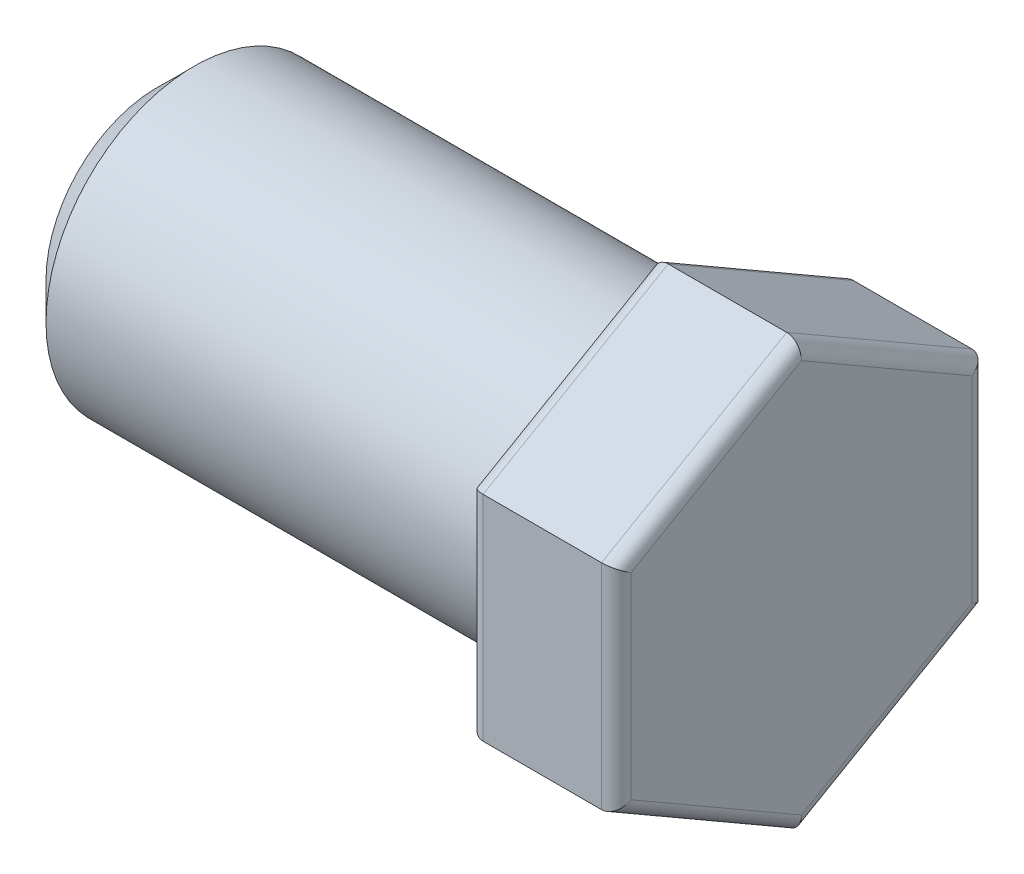
ISO-10303-21;
HEADER;
FILE_DESCRIPTION(('STEP AP214'),'2;1');
FILE_NAME('part.step','',(''),(''),'','','');
FILE_SCHEMA(('AUTOMOTIVE_DESIGN { 1 0 10303 214 1 1 1 1 }'));
ENDSEC;
DATA;
#1=APPLICATION_CONTEXT('core data for automotive mechanical design processes');
#2=APPLICATION_PROTOCOL_DEFINITION('international standard','automotive_design',2000,#1);
#3=PRODUCT_CONTEXT('',#1,'mechanical');
#4=PRODUCT('Part','Part','',(#3));
#5=PRODUCT_RELATED_PRODUCT_CATEGORY('part','',(#4));
#6=PRODUCT_DEFINITION_FORMATION('','',#4);
#7=PRODUCT_DEFINITION_CONTEXT('part definition',#1,'design');
#8=PRODUCT_DEFINITION('design','',#6,#7);
#9=PRODUCT_DEFINITION_SHAPE('','',#8);
#10=(LENGTH_UNIT() NAMED_UNIT(*) SI_UNIT(.MILLI.,.METRE.));
#11=(NAMED_UNIT(*) PLANE_ANGLE_UNIT() SI_UNIT($,.RADIAN.));
#12=(NAMED_UNIT(*) SI_UNIT($,.STERADIAN.) SOLID_ANGLE_UNIT());
#13=UNCERTAINTY_MEASURE_WITH_UNIT(LENGTH_MEASURE(1.E-05),#10,'distance_accuracy_value','');
#14=(GEOMETRIC_REPRESENTATION_CONTEXT(3) GLOBAL_UNCERTAINTY_ASSIGNED_CONTEXT((#13)) GLOBAL_UNIT_ASSIGNED_CONTEXT((#10,
#11,#12)) REPRESENTATION_CONTEXT('',''));
#15=CARTESIAN_POINT('',(0.,0.,0.));
#16=DIRECTION('',(0.,0.,1.));
#17=DIRECTION('',(1.,0.,0.));
#18=AXIS2_PLACEMENT_3D('',#15,#16,#17);
#19=CARTESIAN_POINT('',(1.,-1.44337567297404,-2.50000000000001));
#20=DIRECTION('',(0.,0.,1.));
#21=DIRECTION('',(0.,-1.,0.));
#22=AXIS2_PLACEMENT_3D('',#19,#20,#21);
#23=PLANE('',#22);
#24=DIRECTION('',(-1.,0.,0.));
#25=VECTOR('',#24,1.);
#26=CARTESIAN_POINT('',(1.,1.44337567297409,-2.49999999999999));
#27=LINE('',#26,#25);
#28=CARTESIAN_POINT('',(0.8,1.44337567297409,-2.49999999999999));
#29=VERTEX_POINT('',#28);
#30=CARTESIAN_POINT('',(-0.8,1.44337567297409,-2.49999999999999));
#31=VERTEX_POINT('',#30);
#32=EDGE_CURVE('E157',#29,#31,#27,.T.);
#33=ORIENTED_EDGE('',*,*,#32,.F.);
#34=DIRECTION('',(0.,1.,0.));
#35=VECTOR('',#34,1.);
#36=CARTESIAN_POINT('',(0.8,-1.44337567297404,-2.50000000000001));
#37=LINE('',#36,#35);
#38=CARTESIAN_POINT('',(0.8,-1.44337567297404,-2.50000000000001));
#39=VERTEX_POINT('',#38);
#40=EDGE_CURVE('E203',#29,#39,#37,.F.);
#41=ORIENTED_EDGE('',*,*,#40,.T.);
#42=DIRECTION('',(-1.,0.,0.));
#43=VECTOR('',#42,1.);
#44=CARTESIAN_POINT('',(1.,-1.44337567297404,-2.50000000000001));
#45=LINE('',#44,#43);
#46=CARTESIAN_POINT('',(-0.8,-1.44337567297404,-2.50000000000001));
#47=VERTEX_POINT('',#46);
#48=EDGE_CURVE('E239',#39,#47,#45,.T.);
#49=ORIENTED_EDGE('',*,*,#48,.T.);
#50=DIRECTION('',(0.,1.,0.));
#51=VECTOR('',#50,1.);
#52=CARTESIAN_POINT('',(-0.8,-1.44337567297404,-2.50000000000001));
#53=LINE('',#52,#51);
#54=EDGE_CURVE('E200',#47,#31,#53,.T.);
#55=ORIENTED_EDGE('',*,*,#54,.T.);
#56=EDGE_LOOP('',(#33,#41,#49,#55));
#57=FACE_BOUND('',#56,.T.);
#58=ADVANCED_FACE('F44',(#57),#23,.F.);
#59=CARTESIAN_POINT('',(1.,1.44337567297409,-2.49999999999999));
#60=DIRECTION('',(0.,-0.866025403784443,0.499999999999993));
#61=DIRECTION('',(0.,-0.499999999999993,-0.866025403784443));
#62=AXIS2_PLACEMENT_3D('',#59,#60,#61);
#63=PLANE('',#62);
#64=DIRECTION('',(-1.,0.,0.));
#65=VECTOR('',#64,1.);
#66=CARTESIAN_POINT('',(1.,2.88675134594813,0.));
#67=LINE('',#66,#65);
#68=CARTESIAN_POINT('',(0.8,2.88675134594813,0.));
#69=VERTEX_POINT('',#68);
#70=CARTESIAN_POINT('',(-0.8,2.88675134594813,0.));
#71=VERTEX_POINT('',#70);
#72=EDGE_CURVE('E366',#69,#71,#67,.T.);
#73=ORIENTED_EDGE('',*,*,#72,.F.);
#74=DIRECTION('',(0.,0.499999999999993,0.866025403784443));
#75=VECTOR('',#74,1.);
#76=CARTESIAN_POINT('',(0.8,1.44337567297409,-2.49999999999999));
#77=LINE('',#76,#75);
#78=EDGE_CURVE('E197',#69,#29,#77,.F.);
#79=ORIENTED_EDGE('',*,*,#78,.T.);
#80=ORIENTED_EDGE('',*,*,#32,.T.);
#81=DIRECTION('',(0.,0.499999999999993,0.866025403784443));
#82=VECTOR('',#81,1.);
#83=CARTESIAN_POINT('',(-0.8,1.44337567297409,-2.49999999999999));
#84=LINE('',#83,#82);
#85=EDGE_CURVE('E193',#31,#71,#84,.T.);
#86=ORIENTED_EDGE('',*,*,#85,.T.);
#87=EDGE_LOOP('',(#73,#79,#80,#86));
#88=FACE_BOUND('',#87,.T.);
#89=ADVANCED_FACE('F284',(#88),#63,.F.);
#90=CARTESIAN_POINT('',(1.,2.88675134594813,0.));
#91=DIRECTION('',(0.,-0.866025403784434,-0.500000000000007));
#92=DIRECTION('',(0.,0.500000000000007,-0.866025403784434));
#93=AXIS2_PLACEMENT_3D('',#90,#91,#92);
#94=PLANE('',#93);
#95=DIRECTION('',(-1.,0.,0.));
#96=VECTOR('',#95,1.);
#97=CARTESIAN_POINT('',(1.,1.44337567297404,2.50000000000001));
#98=LINE('',#97,#96);
#99=CARTESIAN_POINT('',(0.8,1.44337567297404,2.50000000000001));
#100=VERTEX_POINT('',#99);
#101=CARTESIAN_POINT('',(-0.8,1.44337567297404,2.50000000000001));
#102=VERTEX_POINT('',#101);
#103=EDGE_CURVE('E369',#100,#102,#98,.T.);
#104=ORIENTED_EDGE('',*,*,#103,.F.);
#105=DIRECTION('',(0.,-0.500000000000007,0.866025403784434));
#106=VECTOR('',#105,1.);
#107=CARTESIAN_POINT('',(0.8,2.88675134594813,0.));
#108=LINE('',#107,#106);
#109=EDGE_CURVE('E190',#100,#69,#108,.F.);
#110=ORIENTED_EDGE('',*,*,#109,.T.);
#111=ORIENTED_EDGE('',*,*,#72,.T.);
#112=DIRECTION('',(0.,-0.500000000000007,0.866025403784434));
#113=VECTOR('',#112,1.);
#114=CARTESIAN_POINT('',(-0.8,2.88675134594813,0.));
#115=LINE('',#114,#113);
#116=EDGE_CURVE('E187',#71,#102,#115,.T.);
#117=ORIENTED_EDGE('',*,*,#116,.T.);
#118=EDGE_LOOP('',(#104,#110,#111,#117));
#119=FACE_BOUND('',#118,.T.);
#120=ADVANCED_FACE('F290',(#119),#94,.F.);
#121=CARTESIAN_POINT('',(1.,1.44337567297404,2.50000000000001));
#122=DIRECTION('',(0.,0.,-1.));
#123=DIRECTION('',(0.,1.,0.));
#124=AXIS2_PLACEMENT_3D('',#121,#122,#123);
#125=PLANE('',#124);
#126=DIRECTION('',(-1.,0.,0.));
#127=VECTOR('',#126,1.);
#128=CARTESIAN_POINT('',(1.,-1.44337567297409,2.49999999999999));
#129=LINE('',#128,#127);
#130=CARTESIAN_POINT('',(0.8,-1.44337567297409,2.49999999999999));
#131=VERTEX_POINT('',#130);
#132=CARTESIAN_POINT('',(-0.8,-1.44337567297409,2.49999999999999));
#133=VERTEX_POINT('',#132);
#134=EDGE_CURVE('E394',#131,#133,#129,.T.);
#135=ORIENTED_EDGE('',*,*,#134,.F.);
#136=DIRECTION('',(0.,-1.,0.));
#137=VECTOR('',#136,1.);
#138=CARTESIAN_POINT('',(0.8,1.44337567297404,2.50000000000001));
#139=LINE('',#138,#137);
#140=EDGE_CURVE('E184',#131,#100,#139,.F.);
#141=ORIENTED_EDGE('',*,*,#140,.T.);
#142=ORIENTED_EDGE('',*,*,#103,.T.);
#143=DIRECTION('',(0.,-1.,0.));
#144=VECTOR('',#143,1.);
#145=CARTESIAN_POINT('',(-0.8,1.44337567297404,2.50000000000001));
#146=LINE('',#145,#144);
#147=EDGE_CURVE('E181',#102,#133,#146,.T.);
#148=ORIENTED_EDGE('',*,*,#147,.T.);
#149=EDGE_LOOP('',(#135,#141,#142,#148));
#150=FACE_BOUND('',#149,.T.);
#151=ADVANCED_FACE('F404',(#150),#125,.F.);
#152=CARTESIAN_POINT('',(1.,-1.44337567297409,2.49999999999999));
#153=DIRECTION('',(0.,0.866025403784443,-0.499999999999993));
#154=DIRECTION('',(0.,0.499999999999993,0.866025403784443));
#155=AXIS2_PLACEMENT_3D('',#152,#153,#154);
#156=PLANE('',#155);
#157=DIRECTION('',(-1.,0.,0.));
#158=VECTOR('',#157,1.);
#159=CARTESIAN_POINT('',(1.,-2.88675134594813,0.));
#160=LINE('',#159,#158);
#161=CARTESIAN_POINT('',(0.8,-2.88675134594813,0.));
#162=VERTEX_POINT('',#161);
#163=CARTESIAN_POINT('',(-0.8,-2.88675134594813,0.));
#164=VERTEX_POINT('',#163);
#165=EDGE_CURVE('E391',#162,#164,#160,.T.);
#166=ORIENTED_EDGE('',*,*,#165,.F.);
#167=DIRECTION('',(0.,-0.499999999999993,-0.866025403784443));
#168=VECTOR('',#167,1.);
#169=CARTESIAN_POINT('',(0.8,-1.44337567297409,2.49999999999999));
#170=LINE('',#169,#168);
#171=EDGE_CURVE('E178',#162,#131,#170,.F.);
#172=ORIENTED_EDGE('',*,*,#171,.T.);
#173=ORIENTED_EDGE('',*,*,#134,.T.);
#174=DIRECTION('',(0.,-0.499999999999993,-0.866025403784443));
#175=VECTOR('',#174,1.);
#176=CARTESIAN_POINT('',(-0.8,-1.44337567297409,2.49999999999999));
#177=LINE('',#176,#175);
#178=EDGE_CURVE('E175',#133,#164,#177,.T.);
#179=ORIENTED_EDGE('',*,*,#178,.T.);
#180=EDGE_LOOP('',(#166,#172,#173,#179));
#181=FACE_BOUND('',#180,.T.);
#182=ADVANCED_FACE('F392',(#181),#156,.F.);
#183=CARTESIAN_POINT('',(1.,-2.88675134594813,0.));
#184=DIRECTION('',(0.,0.866025403784434,0.500000000000008));
#185=DIRECTION('',(0.,-0.500000000000008,0.866025403784434));
#186=AXIS2_PLACEMENT_3D('',#183,#184,#185);
#187=PLANE('',#186);
#188=ORIENTED_EDGE('',*,*,#48,.F.);
#189=DIRECTION('',(0.,0.500000000000008,-0.866025403784434));
#190=VECTOR('',#189,1.);
#191=CARTESIAN_POINT('',(0.8,-2.88675134594813,0.));
#192=LINE('',#191,#190);
#193=EDGE_CURVE('E141',#39,#162,#192,.F.);
#194=ORIENTED_EDGE('',*,*,#193,.T.);
#195=ORIENTED_EDGE('',*,*,#165,.T.);
#196=DIRECTION('',(0.,0.500000000000008,-0.866025403784434));
#197=VECTOR('',#196,1.);
#198=CARTESIAN_POINT('',(-0.8,-2.88675134594813,0.));
#199=LINE('',#198,#197);
#200=EDGE_CURVE('E164',#164,#47,#199,.T.);
#201=ORIENTED_EDGE('',*,*,#200,.T.);
#202=EDGE_LOOP('',(#188,#194,#195,#201));
#203=FACE_BOUND('',#202,.T.);
#204=ADVANCED_FACE('F390',(#203),#187,.F.);
#205=CARTESIAN_POINT('',(1.,0.,0.));
#206=DIRECTION('',(1.,0.,0.));
#207=DIRECTION('',(0.,0.,-1.));
#208=AXIS2_PLACEMENT_3D('',#205,#206,#207);
#209=PLANE('',#208);
#210=DIRECTION('',(0.,-0.499999999999993,-0.866025403784443));
#211=VECTOR('',#210,1.);
#212=CARTESIAN_POINT('',(1.,-2.71354626519124,-0.100000000000023));
#213=LINE('',#212,#211);
#214=CARTESIAN_POINT('',(1.,-1.32790561913616,2.29999999999999));
#215=VERTEX_POINT('',#214);
#216=CARTESIAN_POINT('',(1.,-2.65581123827228,0.));
#217=VERTEX_POINT('',#216);
#218=EDGE_CURVE('E161',#215,#217,#213,.T.);
#219=ORIENTED_EDGE('',*,*,#218,.T.);
#220=DIRECTION('',(0.,0.500000000000008,-0.866025403784434));
#221=VECTOR('',#220,1.);
#222=CARTESIAN_POINT('',(1.,-1.27017059221715,-2.40000000000001));
#223=LINE('',#222,#221);
#224=CARTESIAN_POINT('',(1.,-1.32790561913612,-2.30000000000001));
#225=VERTEX_POINT('',#224);
#226=EDGE_CURVE('E139',#217,#225,#223,.T.);
#227=ORIENTED_EDGE('',*,*,#226,.T.);
#228=DIRECTION('',(0.,1.,0.));
#229=VECTOR('',#228,1.);
#230=CARTESIAN_POINT('',(1.,1.44337567297409,-2.29999999999999));
#231=LINE('',#230,#229);
#232=CARTESIAN_POINT('',(1.,1.32790561913616,-2.29999999999999));
#233=VERTEX_POINT('',#232);
#234=EDGE_CURVE('E149',#225,#233,#231,.T.);
#235=ORIENTED_EDGE('',*,*,#234,.T.);
#236=DIRECTION('',(0.,0.499999999999993,0.866025403784443));
#237=VECTOR('',#236,1.);
#238=CARTESIAN_POINT('',(1.,2.71354626519124,0.100000000000023));
#239=LINE('',#238,#237);
#240=CARTESIAN_POINT('',(1.,2.65581123827228,0.));
#241=VERTEX_POINT('',#240);
#242=EDGE_CURVE('E156',#233,#241,#239,.T.);
#243=ORIENTED_EDGE('',*,*,#242,.T.);
#244=DIRECTION('',(0.,-0.500000000000007,0.866025403784434));
#245=VECTOR('',#244,1.);
#246=CARTESIAN_POINT('',(1.,1.27017059221716,2.40000000000001));
#247=LINE('',#246,#245);
#248=CARTESIAN_POINT('',(1.,1.32790561913612,2.30000000000001));
#249=VERTEX_POINT('',#248);
#250=EDGE_CURVE('E375',#241,#249,#247,.T.);
#251=ORIENTED_EDGE('',*,*,#250,.T.);
#252=DIRECTION('',(0.,-1.,0.));
#253=VECTOR('',#252,1.);
#254=CARTESIAN_POINT('',(1.,-1.44337567297408,2.29999999999999));
#255=LINE('',#254,#253);
#256=EDGE_CURVE('E169',#249,#215,#255,.T.);
#257=ORIENTED_EDGE('',*,*,#256,.T.);
#258=EDGE_LOOP('',(#219,#227,#235,#243,#251,#257));
#259=FACE_BOUND('',#258,.T.);
#260=ADVANCED_FACE('F159',(#259),#209,.T.);
#261=CARTESIAN_POINT('',(-1.,0.,0.));
#262=DIRECTION('',(1.,0.,0.));
#263=DIRECTION('',(0.,0.,-1.));
#264=AXIS2_PLACEMENT_3D('',#261,#262,#263);
#265=PLANE('',#264);
#266=CARTESIAN_POINT('',(-1.,0.,0.));
#267=DIRECTION('',(1.,0.,0.));
#268=DIRECTION('',(0.,0.,-1.));
#269=AXIS2_PLACEMENT_3D('',#266,#267,#268);
#270=CIRCLE('',#269,2.2);
#271=CARTESIAN_POINT('',(-1.,0.,-2.2));
#272=VERTEX_POINT('',#271);
#273=EDGE_CURVE('E11',#272,#272,#270,.T.);
#274=ORIENTED_EDGE('',*,*,#273,.T.);
#275=EDGE_LOOP('',(#274));
#276=FACE_BOUND('',#275,.T.);
#277=DIRECTION('',(0.,-0.500000000000007,0.866025403784434));
#278=VECTOR('',#277,1.);
#279=CARTESIAN_POINT('',(-1.,1.9918584287042,1.15000000000002));
#280=LINE('',#279,#278);
#281=CARTESIAN_POINT('',(-1.,1.32790561913612,2.30000000000001));
#282=VERTEX_POINT('',#281);
#283=CARTESIAN_POINT('',(-1.,2.65581123827228,0.));
#284=VERTEX_POINT('',#283);
#285=EDGE_CURVE('E60',#282,#284,#280,.F.);
#286=ORIENTED_EDGE('',*,*,#285,.T.);
#287=DIRECTION('',(0.,0.499999999999993,0.866025403784443));
#288=VECTOR('',#287,1.);
#289=CARTESIAN_POINT('',(-1.,1.99185842870422,-1.14999999999998));
#290=LINE('',#289,#288);
#291=CARTESIAN_POINT('',(-1.,1.32790561913616,-2.29999999999999));
#292=VERTEX_POINT('',#291);
#293=EDGE_CURVE('E219',#284,#292,#290,.F.);
#294=ORIENTED_EDGE('',*,*,#293,.T.);
#295=DIRECTION('',(0.,1.,0.));
#296=VECTOR('',#295,1.);
#297=CARTESIAN_POINT('',(-1.,0.,-2.3));
#298=LINE('',#297,#296);
#299=CARTESIAN_POINT('',(-1.,-1.32790561913612,-2.30000000000001));
#300=VERTEX_POINT('',#299);
#301=EDGE_CURVE('E206',#292,#300,#298,.F.);
#302=ORIENTED_EDGE('',*,*,#301,.T.);
#303=DIRECTION('',(0.,0.500000000000008,-0.866025403784434));
#304=VECTOR('',#303,1.);
#305=CARTESIAN_POINT('',(-1.,-1.9918584287042,-1.15000000000002));
#306=LINE('',#305,#304);
#307=CARTESIAN_POINT('',(-1.,-2.65581123827228,0.));
#308=VERTEX_POINT('',#307);
#309=EDGE_CURVE('E209',#300,#308,#306,.F.);
#310=ORIENTED_EDGE('',*,*,#309,.T.);
#311=DIRECTION('',(0.,-0.499999999999993,-0.866025403784443));
#312=VECTOR('',#311,1.);
#313=CARTESIAN_POINT('',(-1.,-1.99185842870422,1.14999999999998));
#314=LINE('',#313,#312);
#315=CARTESIAN_POINT('',(-1.,-1.32790561913616,2.29999999999999));
#316=VERTEX_POINT('',#315);
#317=EDGE_CURVE('E212',#308,#316,#314,.F.);
#318=ORIENTED_EDGE('',*,*,#317,.T.);
#319=DIRECTION('',(0.,-1.,0.));
#320=VECTOR('',#319,1.);
#321=CARTESIAN_POINT('',(-1.,0.,2.3));
#322=LINE('',#321,#320);
#323=EDGE_CURVE('E65',#316,#282,#322,.F.);
#324=ORIENTED_EDGE('',*,*,#323,.T.);
#325=EDGE_LOOP('',(#286,#294,#302,#310,#318,#324));
#326=FACE_BOUND('',#325,.T.);
#327=ADVANCED_FACE('F316',(#276,#326),#265,.F.);
#328=CARTESIAN_POINT('',(0.8,1.9918584287042,1.15000000000002));
#329=DIRECTION('',(0.,0.500000000000007,-0.866025403784434));
#330=DIRECTION('',(0.,0.866025403784434,0.500000000000007));
#331=AXIS2_PLACEMENT_3D('',#328,#329,#330);
#332=CYLINDRICAL_SURFACE('',#331,0.2);
#333=CARTESIAN_POINT('',(0.8,2.65581123827228,0.));
#334=DIRECTION('',(0.,0.,-1.));
#335=DIRECTION('',(0.,-1.,0.));
#336=AXIS2_PLACEMENT_3D('',#333,#334,#335);
#337=ELLIPSE('',#336,0.23094010767585,0.2);
#338=EDGE_CURVE('E231',#69,#241,#337,.T.);
#339=ORIENTED_EDGE('',*,*,#338,.F.);
#340=ORIENTED_EDGE('',*,*,#109,.F.);
#341=CARTESIAN_POINT('',(0.8,1.32790561913612,2.30000000000001));
#342=DIRECTION('',(0.,0.866025403784443,-0.499999999999993));
#343=DIRECTION('',(0.,-0.499999999999993,-0.866025403784443));
#344=AXIS2_PLACEMENT_3D('',#341,#342,#343);
#345=ELLIPSE('',#344,0.23094010767585,0.2);
#346=EDGE_CURVE('E235',#249,#100,#345,.F.);
#347=ORIENTED_EDGE('',*,*,#346,.F.);
#348=ORIENTED_EDGE('',*,*,#250,.F.);
#349=EDGE_LOOP('',(#339,#340,#347,#348));
#350=FACE_BOUND('',#349,.T.);
#351=ADVANCED_FACE('F312',(#350),#332,.T.);
#352=CARTESIAN_POINT('',(0.8,0.,2.3));
#353=DIRECTION('',(0.,1.,0.));
#354=DIRECTION('',(0.,0.,1.));
#355=AXIS2_PLACEMENT_3D('',#352,#353,#354);
#356=CYLINDRICAL_SURFACE('',#355,0.2);
#357=ORIENTED_EDGE('',*,*,#346,.T.);
#358=ORIENTED_EDGE('',*,*,#140,.F.);
#359=CARTESIAN_POINT('',(0.8,-1.32790561913616,2.29999999999999));
#360=DIRECTION('',(0.,0.866025403784434,0.500000000000007));
#361=DIRECTION('',(0.,0.500000000000007,-0.866025403784434));
#362=AXIS2_PLACEMENT_3D('',#359,#360,#361);
#363=ELLIPSE('',#362,0.23094010767585,0.2);
#364=EDGE_CURVE('E227',#215,#131,#363,.F.);
#365=ORIENTED_EDGE('',*,*,#364,.F.);
#366=ORIENTED_EDGE('',*,*,#256,.F.);
#367=EDGE_LOOP('',(#357,#358,#365,#366));
#368=FACE_BOUND('',#367,.T.);
#369=ADVANCED_FACE('F308',(#368),#356,.T.);
#370=CARTESIAN_POINT('',(0.8,1.99185842870422,-1.14999999999998));
#371=DIRECTION('',(0.,-0.499999999999993,-0.866025403784443));
#372=DIRECTION('',(0.,0.866025403784443,-0.499999999999993));
#373=AXIS2_PLACEMENT_3D('',#370,#371,#372);
#374=CYLINDRICAL_SURFACE('',#373,0.2);
#375=ORIENTED_EDGE('',*,*,#338,.T.);
#376=ORIENTED_EDGE('',*,*,#242,.F.);
#377=CARTESIAN_POINT('',(0.8,1.32790561913616,-2.29999999999999));
#378=DIRECTION('',(0.,-0.866025403784434,-0.500000000000007));
#379=DIRECTION('',(0.,-0.500000000000007,0.866025403784434));
#380=AXIS2_PLACEMENT_3D('',#377,#378,#379);
#381=ELLIPSE('',#380,0.23094010767585,0.2);
#382=EDGE_CURVE('E152',#29,#233,#381,.T.);
#383=ORIENTED_EDGE('',*,*,#382,.F.);
#384=ORIENTED_EDGE('',*,*,#78,.F.);
#385=EDGE_LOOP('',(#375,#376,#383,#384));
#386=FACE_BOUND('',#385,.T.);
#387=ADVANCED_FACE('F304',(#386),#374,.T.);
#388=CARTESIAN_POINT('',(0.8,-1.99185842870422,1.14999999999998));
#389=DIRECTION('',(0.,0.499999999999993,0.866025403784443));
#390=DIRECTION('',(0.,-0.866025403784443,0.499999999999993));
#391=AXIS2_PLACEMENT_3D('',#388,#389,#390);
#392=CYLINDRICAL_SURFACE('',#391,0.2);
#393=ORIENTED_EDGE('',*,*,#364,.T.);
#394=ORIENTED_EDGE('',*,*,#171,.F.);
#395=CARTESIAN_POINT('',(0.8,-2.65581123827228,0.));
#396=DIRECTION('',(0.,0.,1.));
#397=DIRECTION('',(0.,1.,0.));
#398=AXIS2_PLACEMENT_3D('',#395,#396,#397);
#399=ELLIPSE('',#398,0.23094010767585,0.2);
#400=EDGE_CURVE('E145',#217,#162,#399,.F.);
#401=ORIENTED_EDGE('',*,*,#400,.F.);
#402=ORIENTED_EDGE('',*,*,#218,.F.);
#403=EDGE_LOOP('',(#393,#394,#401,#402));
#404=FACE_BOUND('',#403,.T.);
#405=ADVANCED_FACE('F301',(#404),#392,.T.);
#406=CARTESIAN_POINT('',(0.8,0.,-2.3));
#407=DIRECTION('',(0.,-1.,0.));
#408=DIRECTION('',(0.,0.,-1.));
#409=AXIS2_PLACEMENT_3D('',#406,#407,#408);
#410=CYLINDRICAL_SURFACE('',#409,0.2);
#411=ORIENTED_EDGE('',*,*,#382,.T.);
#412=ORIENTED_EDGE('',*,*,#234,.F.);
#413=CARTESIAN_POINT('',(0.8,-1.32790561913612,-2.30000000000001));
#414=DIRECTION('',(0.,-0.866025403784443,0.499999999999992));
#415=DIRECTION('',(0.,-0.499999999999992,-0.866025403784443));
#416=AXIS2_PLACEMENT_3D('',#413,#414,#415);
#417=ELLIPSE('',#416,0.23094010767585,0.2);
#418=EDGE_CURVE('E135',#39,#225,#417,.T.);
#419=ORIENTED_EDGE('',*,*,#418,.F.);
#420=ORIENTED_EDGE('',*,*,#40,.F.);
#421=EDGE_LOOP('',(#411,#412,#419,#420));
#422=FACE_BOUND('',#421,.T.);
#423=ADVANCED_FACE('F150',(#422),#410,.T.);
#424=CARTESIAN_POINT('',(0.8,-1.9918584287042,-1.15000000000002));
#425=DIRECTION('',(0.,-0.500000000000008,0.866025403784434));
#426=DIRECTION('',(0.,-0.866025403784434,-0.500000000000008));
#427=AXIS2_PLACEMENT_3D('',#424,#425,#426);
#428=CYLINDRICAL_SURFACE('',#427,0.2);
#429=ORIENTED_EDGE('',*,*,#400,.T.);
#430=ORIENTED_EDGE('',*,*,#193,.F.);
#431=ORIENTED_EDGE('',*,*,#418,.T.);
#432=ORIENTED_EDGE('',*,*,#226,.F.);
#433=EDGE_LOOP('',(#429,#430,#431,#432));
#434=FACE_BOUND('',#433,.T.);
#435=ADVANCED_FACE('F137',(#434),#428,.T.);
#436=CARTESIAN_POINT('',(-0.8,-1.2701705922172,2.39999999999999));
#437=DIRECTION('',(0.,-0.499999999999993,-0.866025403784443));
#438=DIRECTION('',(0.,0.866025403784443,-0.499999999999993));
#439=AXIS2_PLACEMENT_3D('',#436,#437,#438);
#440=CYLINDRICAL_SURFACE('',#439,0.2);
#441=CARTESIAN_POINT('',(-0.8,-1.32790561913616,2.29999999999999));
#442=DIRECTION('',(0.,-0.866025403784434,-0.500000000000007));
#443=DIRECTION('',(0.,0.500000000000007,-0.866025403784434));
#444=AXIS2_PLACEMENT_3D('',#441,#442,#443);
#445=ELLIPSE('',#444,0.23094010767585,0.2);
#446=EDGE_CURVE('E254',#316,#133,#445,.F.);
#447=ORIENTED_EDGE('',*,*,#446,.F.);
#448=ORIENTED_EDGE('',*,*,#317,.F.);
#449=CARTESIAN_POINT('',(-0.8,-2.65581123827228,0.));
#450=DIRECTION('',(0.,0.,-1.));
#451=DIRECTION('',(0.,1.,0.));
#452=AXIS2_PLACEMENT_3D('',#449,#450,#451);
#453=ELLIPSE('',#452,0.23094010767585,0.2);
#454=EDGE_CURVE('E146',#164,#308,#453,.T.);
#455=ORIENTED_EDGE('',*,*,#454,.F.);
#456=ORIENTED_EDGE('',*,*,#178,.F.);
#457=EDGE_LOOP('',(#447,#448,#455,#456));
#458=FACE_BOUND('',#457,.T.);
#459=ADVANCED_FACE('F298',(#458),#440,.T.);
#460=CARTESIAN_POINT('',(-0.8,-2.71354626519124,0.0999999999999777));
#461=DIRECTION('',(0.,0.500000000000008,-0.866025403784434));
#462=DIRECTION('',(0.,0.866025403784434,0.500000000000008));
#463=AXIS2_PLACEMENT_3D('',#460,#461,#462);
#464=CYLINDRICAL_SURFACE('',#463,0.2);
#465=ORIENTED_EDGE('',*,*,#454,.T.);
#466=ORIENTED_EDGE('',*,*,#309,.F.);
#467=CARTESIAN_POINT('',(-0.8,-1.32790561913612,-2.30000000000001));
#468=DIRECTION('',(0.,0.866025403784443,-0.499999999999992));
#469=DIRECTION('',(0.,0.499999999999992,0.866025403784443));
#470=AXIS2_PLACEMENT_3D('',#467,#468,#469);
#471=ELLIPSE('',#470,0.23094010767585,0.2);
#472=EDGE_CURVE('E250',#47,#300,#471,.T.);
#473=ORIENTED_EDGE('',*,*,#472,.F.);
#474=ORIENTED_EDGE('',*,*,#200,.F.);
#475=EDGE_LOOP('',(#465,#466,#473,#474));
#476=FACE_BOUND('',#475,.T.);
#477=ADVANCED_FACE('F333',(#476),#464,.T.);
#478=CARTESIAN_POINT('',(-0.8,1.44337567297405,2.30000000000001));
#479=DIRECTION('',(0.,-1.,0.));
#480=DIRECTION('',(0.,0.,-1.));
#481=AXIS2_PLACEMENT_3D('',#478,#479,#480);
#482=CYLINDRICAL_SURFACE('',#481,0.2);
#483=ORIENTED_EDGE('',*,*,#446,.T.);
#484=ORIENTED_EDGE('',*,*,#147,.F.);
#485=CARTESIAN_POINT('',(-0.8,1.32790561913612,2.30000000000001));
#486=DIRECTION('',(0.,-0.866025403784443,0.499999999999993));
#487=DIRECTION('',(0.,-0.499999999999993,-0.866025403784443));
#488=AXIS2_PLACEMENT_3D('',#485,#486,#487);
#489=ELLIPSE('',#488,0.23094010767585,0.2);
#490=EDGE_CURVE('E246',#282,#102,#489,.F.);
#491=ORIENTED_EDGE('',*,*,#490,.F.);
#492=ORIENTED_EDGE('',*,*,#323,.F.);
#493=EDGE_LOOP('',(#483,#484,#491,#492));
#494=FACE_BOUND('',#493,.T.);
#495=ADVANCED_FACE('F329',(#494),#482,.T.);
#496=CARTESIAN_POINT('',(-0.8,-1.44337567297404,-2.30000000000001));
#497=DIRECTION('',(0.,1.,0.));
#498=DIRECTION('',(0.,0.,1.));
#499=AXIS2_PLACEMENT_3D('',#496,#497,#498);
#500=CYLINDRICAL_SURFACE('',#499,0.2);
#501=ORIENTED_EDGE('',*,*,#472,.T.);
#502=ORIENTED_EDGE('',*,*,#301,.F.);
#503=CARTESIAN_POINT('',(-0.8,1.32790561913616,-2.29999999999999));
#504=DIRECTION('',(0.,0.866025403784434,0.500000000000007));
#505=DIRECTION('',(0.,0.500000000000007,-0.866025403784434));
#506=AXIS2_PLACEMENT_3D('',#503,#504,#505);
#507=ELLIPSE('',#506,0.23094010767585,0.2);
#508=EDGE_CURVE('E243',#31,#292,#507,.T.);
#509=ORIENTED_EDGE('',*,*,#508,.F.);
#510=ORIENTED_EDGE('',*,*,#54,.F.);
#511=EDGE_LOOP('',(#501,#502,#509,#510));
#512=FACE_BOUND('',#511,.T.);
#513=ADVANCED_FACE('F325',(#512),#500,.T.);
#514=CARTESIAN_POINT('',(-0.8,2.71354626519124,-0.0999999999999772));
#515=DIRECTION('',(0.,-0.500000000000007,0.866025403784434));
#516=DIRECTION('',(0.,-0.866025403784434,-0.500000000000007));
#517=AXIS2_PLACEMENT_3D('',#514,#515,#516);
#518=CYLINDRICAL_SURFACE('',#517,0.2);
#519=ORIENTED_EDGE('',*,*,#490,.T.);
#520=ORIENTED_EDGE('',*,*,#116,.F.);
#521=CARTESIAN_POINT('',(-0.8,2.65581123827228,0.));
#522=DIRECTION('',(0.,0.,1.));
#523=DIRECTION('',(0.,-1.,0.));
#524=AXIS2_PLACEMENT_3D('',#521,#522,#523);
#525=ELLIPSE('',#524,0.23094010767585,0.2);
#526=EDGE_CURVE('E240',#284,#71,#525,.F.);
#527=ORIENTED_EDGE('',*,*,#526,.F.);
#528=ORIENTED_EDGE('',*,*,#285,.F.);
#529=EDGE_LOOP('',(#519,#520,#527,#528));
#530=FACE_BOUND('',#529,.T.);
#531=ADVANCED_FACE('F321',(#530),#518,.T.);
#532=CARTESIAN_POINT('',(-0.8,1.2701705922172,-2.39999999999999));
#533=DIRECTION('',(0.,0.499999999999993,0.866025403784443));
#534=DIRECTION('',(0.,-0.866025403784443,0.499999999999993));
#535=AXIS2_PLACEMENT_3D('',#532,#533,#534);
#536=CYLINDRICAL_SURFACE('',#535,0.2);
#537=ORIENTED_EDGE('',*,*,#508,.T.);
#538=ORIENTED_EDGE('',*,*,#293,.F.);
#539=ORIENTED_EDGE('',*,*,#526,.T.);
#540=ORIENTED_EDGE('',*,*,#85,.F.);
#541=EDGE_LOOP('',(#537,#538,#539,#540));
#542=FACE_BOUND('',#541,.T.);
#543=ADVANCED_FACE('F318',(#542),#536,.T.);
#544=CARTESIAN_POINT('',(-7.7,0.,0.));
#545=DIRECTION('',(1.,0.,0.));
#546=DIRECTION('',(0.,0.,-1.));
#547=AXIS2_PLACEMENT_3D('',#544,#545,#546);
#548=CYLINDRICAL_SURFACE('',#547,2.);
#549=CARTESIAN_POINT('',(-1.2,0.,0.));
#550=DIRECTION('',(1.,0.,0.));
#551=DIRECTION('',(0.,0.,-1.));
#552=AXIS2_PLACEMENT_3D('',#549,#550,#551);
#553=CIRCLE('',#552,2.);
#554=CARTESIAN_POINT('',(-1.2,0.,-2.));
#555=VERTEX_POINT('',#554);
#556=EDGE_CURVE('E53',#555,#555,#553,.F.);
#557=ORIENTED_EDGE('',*,*,#556,.T.);
#558=EDGE_LOOP('',(#557));
#559=FACE_BOUND('',#558,.T.);
#560=CARTESIAN_POINT('',(-7.2,0.,0.));
#561=DIRECTION('',(-1.,0.,0.));
#562=DIRECTION('',(0.,0.,1.));
#563=AXIS2_PLACEMENT_3D('',#560,#561,#562);
#564=CIRCLE('',#563,2.);
#565=CARTESIAN_POINT('',(-7.2,0.,2.));
#566=VERTEX_POINT('',#565);
#567=EDGE_CURVE('E264',#566,#566,#564,.F.);
#568=ORIENTED_EDGE('',*,*,#567,.T.);
#569=EDGE_LOOP('',(#568));
#570=FACE_BOUND('',#569,.T.);
#571=ADVANCED_FACE('F271',(#559,#570),#548,.T.);
#572=CARTESIAN_POINT('',(-7.7,0.,0.));
#573=DIRECTION('',(-1.,0.,0.));
#574=DIRECTION('',(0.,0.,1.));
#575=AXIS2_PLACEMENT_3D('',#572,#573,#574);
#576=PLANE('',#575);
#577=CARTESIAN_POINT('',(-7.7,0.,0.));
#578=DIRECTION('',(-1.,0.,0.));
#579=DIRECTION('',(0.,0.,1.));
#580=AXIS2_PLACEMENT_3D('',#577,#578,#579);
#581=CIRCLE('',#580,1.5);
#582=CARTESIAN_POINT('',(-7.7,0.,1.5));
#583=VERTEX_POINT('',#582);
#584=EDGE_CURVE('E221',#583,#583,#581,.T.);
#585=ORIENTED_EDGE('',*,*,#584,.T.);
#586=EDGE_LOOP('',(#585));
#587=FACE_BOUND('',#586,.T.);
#588=ADVANCED_FACE('F280',(#587),#576,.T.);
#589=CARTESIAN_POINT('',(-7.7,0.,0.));
#590=DIRECTION('',(1.,0.,0.));
#591=DIRECTION('',(0.,0.,-1.));
#592=AXIS2_PLACEMENT_3D('',#589,#590,#591);
#593=CONICAL_SURFACE('',#592,1.5,0.785398163397447);
#594=ORIENTED_EDGE('',*,*,#567,.F.);
#595=EDGE_LOOP('',(#594));
#596=FACE_BOUND('',#595,.T.);
#597=ORIENTED_EDGE('',*,*,#584,.F.);
#598=EDGE_LOOP('',(#597));
#599=FACE_BOUND('',#598,.T.);
#600=ADVANCED_FACE('F275',(#596,#599),#593,.T.);
#601=CARTESIAN_POINT('',(-1.2,0.,0.));
#602=DIRECTION('',(1.,0.,0.));
#603=DIRECTION('',(0.,0.,-1.));
#604=AXIS2_PLACEMENT_3D('',#601,#602,#603);
#605=TOROIDAL_SURFACE('',#604,2.2,0.2);
#606=ORIENTED_EDGE('',*,*,#273,.F.);
#607=EDGE_LOOP('',(#606));
#608=FACE_BOUND('',#607,.T.);
#609=ORIENTED_EDGE('',*,*,#556,.F.);
#610=EDGE_LOOP('',(#609));
#611=FACE_BOUND('',#610,.T.);
#612=ADVANCED_FACE('F46',(#608,#611),#605,.F.);
#613=CLOSED_SHELL('',(#58,#89,#120,#151,#182,#204,#260,#327,#351,#369,#387,#405,#423,#435,#459,
#477,#495,#513,#531,#543,#571,#588,#600,#612));
#614=MANIFOLD_SOLID_BREP('B2',#613);
#615=ADVANCED_BREP_SHAPE_REPRESENTATION('',(#18,#614),#14);
#616=SHAPE_DEFINITION_REPRESENTATION(#9,#615);
ENDSEC;
END-ISO-10303-21;
